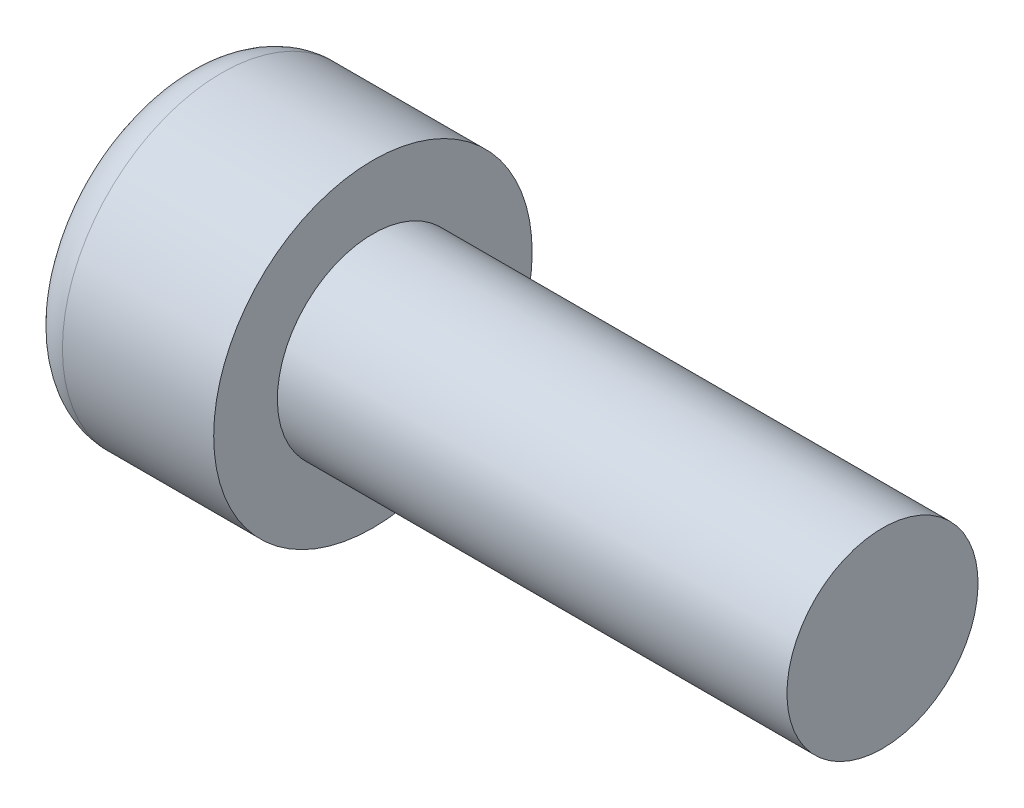
ISO-10303-21;
HEADER;
FILE_DESCRIPTION(('STEP AP214'),'2;1');
FILE_NAME('part.step','',(''),(''),'','','');
FILE_SCHEMA(('AUTOMOTIVE_DESIGN { 1 0 10303 214 1 1 1 1 }'));
ENDSEC;
DATA;
#1=APPLICATION_CONTEXT('core data for automotive mechanical design processes');
#2=APPLICATION_PROTOCOL_DEFINITION('international standard','automotive_design',2000,#1);
#3=PRODUCT_CONTEXT('',#1,'mechanical');
#4=PRODUCT('Part','Part','',(#3));
#5=PRODUCT_RELATED_PRODUCT_CATEGORY('part','',(#4));
#6=PRODUCT_DEFINITION_FORMATION('','',#4);
#7=PRODUCT_DEFINITION_CONTEXT('part definition',#1,'design');
#8=PRODUCT_DEFINITION('design','',#6,#7);
#9=PRODUCT_DEFINITION_SHAPE('','',#8);
#10=(LENGTH_UNIT() NAMED_UNIT(*) SI_UNIT(.MILLI.,.METRE.));
#11=(NAMED_UNIT(*) PLANE_ANGLE_UNIT() SI_UNIT($,.RADIAN.));
#12=(NAMED_UNIT(*) SI_UNIT($,.STERADIAN.) SOLID_ANGLE_UNIT());
#13=UNCERTAINTY_MEASURE_WITH_UNIT(LENGTH_MEASURE(1.E-05),#10,'distance_accuracy_value','');
#14=(GEOMETRIC_REPRESENTATION_CONTEXT(3) GLOBAL_UNCERTAINTY_ASSIGNED_CONTEXT((#13)) GLOBAL_UNIT_ASSIGNED_CONTEXT((#10,
#11,#12)) REPRESENTATION_CONTEXT('',''));
#15=CARTESIAN_POINT('',(0.,0.,0.));
#16=DIRECTION('',(0.,0.,1.));
#17=DIRECTION('',(1.,0.,0.));
#18=AXIS2_PLACEMENT_3D('',#15,#16,#17);
#19=CARTESIAN_POINT('',(0.,0.,0.));
#20=DIRECTION('',(1.,0.,0.));
#21=DIRECTION('',(0.,1.,0.));
#22=AXIS2_PLACEMENT_3D('',#19,#20,#21);
#23=PLANE('',#22);
#24=DIRECTION('',(0.,-0.5,-0.866025403784439));
#25=VECTOR('',#24,1.);
#26=CARTESIAN_POINT('',(0.,2.88675134594813,0.));
#27=LINE('',#26,#25);
#28=CARTESIAN_POINT('',(0.,2.88675134594813,0.));
#29=VERTEX_POINT('',#28);
#30=CARTESIAN_POINT('',(0.,1.44337567297407,-2.5));
#31=VERTEX_POINT('',#30);
#32=EDGE_CURVE('E123',#29,#31,#27,.T.);
#33=ORIENTED_EDGE('',*,*,#32,.F.);
#34=DIRECTION('',(0.,0.5,-0.866025403784439));
#35=VECTOR('',#34,1.);
#36=CARTESIAN_POINT('',(0.,1.44337567297407,2.5));
#37=LINE('',#36,#35);
#38=CARTESIAN_POINT('',(0.,1.44337567297407,2.5));
#39=VERTEX_POINT('',#38);
#40=EDGE_CURVE('E49',#39,#29,#37,.T.);
#41=ORIENTED_EDGE('',*,*,#40,.F.);
#42=DIRECTION('',(0.,1.,0.));
#43=VECTOR('',#42,1.);
#44=CARTESIAN_POINT('',(0.,-1.44337567297407,2.5));
#45=LINE('',#44,#43);
#46=CARTESIAN_POINT('',(0.,-1.44337567297407,2.5));
#47=VERTEX_POINT('',#46);
#48=EDGE_CURVE('E132',#47,#39,#45,.T.);
#49=ORIENTED_EDGE('',*,*,#48,.F.);
#50=DIRECTION('',(0.,0.5,0.866025403784439));
#51=VECTOR('',#50,1.);
#52=CARTESIAN_POINT('',(0.,-2.88675134594813,0.));
#53=LINE('',#52,#51);
#54=CARTESIAN_POINT('',(0.,-2.88675134594813,0.));
#55=VERTEX_POINT('',#54);
#56=EDGE_CURVE('E130',#55,#47,#53,.T.);
#57=ORIENTED_EDGE('',*,*,#56,.F.);
#58=DIRECTION('',(0.,-0.5,0.866025403784439));
#59=VECTOR('',#58,1.);
#60=CARTESIAN_POINT('',(0.,-1.44337567297406,-2.5));
#61=LINE('',#60,#59);
#62=CARTESIAN_POINT('',(0.,-1.44337567297406,-2.5));
#63=VERTEX_POINT('',#62);
#64=EDGE_CURVE('E97',#63,#55,#61,.T.);
#65=ORIENTED_EDGE('',*,*,#64,.F.);
#66=DIRECTION('',(0.,-1.,0.));
#67=VECTOR('',#66,1.);
#68=CARTESIAN_POINT('',(0.,1.44337567297407,-2.5));
#69=LINE('',#68,#67);
#70=EDGE_CURVE('E126',#31,#63,#69,.T.);
#71=ORIENTED_EDGE('',*,*,#70,.F.);
#72=EDGE_LOOP('',(#33,#41,#49,#57,#65,#71));
#73=FACE_BOUND('',#72,.T.);
#74=CARTESIAN_POINT('',(0.,0.,0.));
#75=DIRECTION('',(-1.,0.,0.));
#76=DIRECTION('',(0.,-1.,0.));
#77=AXIS2_PLACEMENT_3D('',#74,#75,#76);
#78=CIRCLE('',#77,3.75);
#79=CARTESIAN_POINT('',(0.,-3.75,0.));
#80=VERTEX_POINT('',#79);
#81=EDGE_CURVE('E11',#80,#80,#78,.T.);
#82=ORIENTED_EDGE('',*,*,#81,.T.);
#83=EDGE_LOOP('',(#82));
#84=FACE_BOUND('',#83,.T.);
#85=ADVANCED_FACE('F35',(#73,#84),#23,.F.);
#86=CARTESIAN_POINT('',(1.25,0.,0.));
#87=DIRECTION('',(-1.,0.,0.));
#88=DIRECTION('',(0.,-1.,0.));
#89=AXIS2_PLACEMENT_3D('',#86,#87,#88);
#90=TOROIDAL_SURFACE('',#89,3.75,1.25);
#91=ORIENTED_EDGE('',*,*,#81,.F.);
#92=EDGE_LOOP('',(#91));
#93=FACE_BOUND('',#92,.T.);
#94=CARTESIAN_POINT('',(1.25,0.,0.));
#95=DIRECTION('',(-1.,0.,0.));
#96=DIRECTION('',(0.,-1.,0.));
#97=AXIS2_PLACEMENT_3D('',#94,#95,#96);
#98=CIRCLE('',#97,5.);
#99=CARTESIAN_POINT('',(1.25,-5.,0.));
#100=VERTEX_POINT('',#99);
#101=EDGE_CURVE('E42',#100,#100,#98,.T.);
#102=ORIENTED_EDGE('',*,*,#101,.T.);
#103=EDGE_LOOP('',(#102));
#104=FACE_BOUND('',#103,.T.);
#105=ADVANCED_FACE('F152',(#93,#104),#90,.T.);
#106=CARTESIAN_POINT('',(0.,0.,0.));
#107=DIRECTION('',(-1.,0.,0.));
#108=DIRECTION('',(0.,-1.,0.));
#109=AXIS2_PLACEMENT_3D('',#106,#107,#108);
#110=CYLINDRICAL_SURFACE('',#109,5.);
#111=ORIENTED_EDGE('',*,*,#101,.F.);
#112=EDGE_LOOP('',(#111));
#113=FACE_BOUND('',#112,.T.);
#114=CARTESIAN_POINT('',(6.,0.,0.));
#115=DIRECTION('',(-1.,0.,0.));
#116=DIRECTION('',(0.,-1.,0.));
#117=AXIS2_PLACEMENT_3D('',#114,#115,#116);
#118=CIRCLE('',#117,5.);
#119=CARTESIAN_POINT('',(6.,-5.,0.));
#120=VERTEX_POINT('',#119);
#121=EDGE_CURVE('E147',#120,#120,#118,.T.);
#122=ORIENTED_EDGE('',*,*,#121,.T.);
#123=EDGE_LOOP('',(#122));
#124=FACE_BOUND('',#123,.T.);
#125=ADVANCED_FACE('F154',(#113,#124),#110,.T.);
#126=CARTESIAN_POINT('',(6.,5.,0.));
#127=DIRECTION('',(-1.,0.,0.));
#128=DIRECTION('',(0.,-1.,0.));
#129=AXIS2_PLACEMENT_3D('',#126,#127,#128);
#130=PLANE('',#129);
#131=ORIENTED_EDGE('',*,*,#121,.F.);
#132=EDGE_LOOP('',(#131));
#133=FACE_BOUND('',#132,.T.);
#134=CARTESIAN_POINT('',(6.,0.,0.));
#135=DIRECTION('',(-1.,0.,0.));
#136=DIRECTION('',(0.,-1.,0.));
#137=AXIS2_PLACEMENT_3D('',#134,#135,#136);
#138=CIRCLE('',#137,2.99999999999999);
#139=CARTESIAN_POINT('',(6.,-2.99999999999999,0.));
#140=VERTEX_POINT('',#139);
#141=EDGE_CURVE('E144',#140,#140,#138,.T.);
#142=ORIENTED_EDGE('',*,*,#141,.T.);
#143=EDGE_LOOP('',(#142));
#144=FACE_BOUND('',#143,.T.);
#145=ADVANCED_FACE('F157',(#133,#144),#130,.F.);
#146=CARTESIAN_POINT('',(0.,0.,0.));
#147=DIRECTION('',(-1.,0.,0.));
#148=DIRECTION('',(0.,-1.,0.));
#149=AXIS2_PLACEMENT_3D('',#146,#147,#148);
#150=CYLINDRICAL_SURFACE('',#149,2.99999999999999);
#151=ORIENTED_EDGE('',*,*,#141,.F.);
#152=EDGE_LOOP('',(#151));
#153=FACE_BOUND('',#152,.T.);
#154=CARTESIAN_POINT('',(22.,0.,0.));
#155=DIRECTION('',(-1.,0.,0.));
#156=DIRECTION('',(0.,-1.,0.));
#157=AXIS2_PLACEMENT_3D('',#154,#155,#156);
#158=CIRCLE('',#157,3.);
#159=CARTESIAN_POINT('',(22.,-2.99999999999999,0.));
#160=VERTEX_POINT('',#159);
#161=EDGE_CURVE('E136',#160,#160,#158,.T.);
#162=ORIENTED_EDGE('',*,*,#161,.T.);
#163=EDGE_LOOP('',(#162));
#164=FACE_BOUND('',#163,.T.);
#165=ADVANCED_FACE('F163',(#153,#164),#150,.T.);
#166=CARTESIAN_POINT('',(22.,3.,0.));
#167=DIRECTION('',(-1.,0.,0.));
#168=DIRECTION('',(0.,-1.,0.));
#169=AXIS2_PLACEMENT_3D('',#166,#167,#168);
#170=PLANE('',#169);
#171=ORIENTED_EDGE('',*,*,#161,.F.);
#172=EDGE_LOOP('',(#171));
#173=FACE_BOUND('',#172,.T.);
#174=ADVANCED_FACE('F169',(#173),#170,.F.);
#175=CARTESIAN_POINT('',(3.5,1.44337567297406,2.5));
#176=DIRECTION('',(0.,0.866025403784439,0.5));
#177=DIRECTION('',(0.,-0.5,0.866025403784439));
#178=AXIS2_PLACEMENT_3D('',#175,#176,#177);
#179=PLANE('',#178);
#180=ORIENTED_EDGE('',*,*,#40,.T.);
#181=DIRECTION('',(-1.,0.,0.));
#182=VECTOR('',#181,1.);
#183=CARTESIAN_POINT('',(3.5,2.88675134594813,0.));
#184=LINE('',#183,#182);
#185=CARTESIAN_POINT('',(3.5,2.88675134594813,0.));
#186=VERTEX_POINT('',#185);
#187=EDGE_CURVE('E79',#186,#29,#184,.T.);
#188=ORIENTED_EDGE('',*,*,#187,.F.);
#189=DIRECTION('',(0.,0.5,-0.866025403784439));
#190=VECTOR('',#189,1.);
#191=CARTESIAN_POINT('',(3.5,1.44337567297406,2.5));
#192=LINE('',#191,#190);
#193=CARTESIAN_POINT('',(3.5,1.44337567297406,2.5));
#194=VERTEX_POINT('',#193);
#195=EDGE_CURVE('E134',#194,#186,#192,.T.);
#196=ORIENTED_EDGE('',*,*,#195,.F.);
#197=DIRECTION('',(-1.,0.,0.));
#198=VECTOR('',#197,1.);
#199=CARTESIAN_POINT('',(3.5,1.44337567297406,2.5));
#200=LINE('',#199,#198);
#201=EDGE_CURVE('E57',#194,#39,#200,.T.);
#202=ORIENTED_EDGE('',*,*,#201,.T.);
#203=EDGE_LOOP('',(#180,#188,#196,#202));
#204=FACE_BOUND('',#203,.T.);
#205=ADVANCED_FACE('F174',(#204),#179,.F.);
#206=CARTESIAN_POINT('',(3.5,-1.44337567297407,2.5));
#207=DIRECTION('',(0.,0.,1.));
#208=DIRECTION('',(1.,0.,0.));
#209=AXIS2_PLACEMENT_3D('',#206,#207,#208);
#210=PLANE('',#209);
#211=ORIENTED_EDGE('',*,*,#48,.T.);
#212=ORIENTED_EDGE('',*,*,#201,.F.);
#213=DIRECTION('',(0.,1.,0.));
#214=VECTOR('',#213,1.);
#215=CARTESIAN_POINT('',(3.5,-1.44337567297407,2.5));
#216=LINE('',#215,#214);
#217=CARTESIAN_POINT('',(3.5,-1.44337567297407,2.5));
#218=VERTEX_POINT('',#217);
#219=EDGE_CURVE('E109',#218,#194,#216,.T.);
#220=ORIENTED_EDGE('',*,*,#219,.F.);
#221=DIRECTION('',(-1.,0.,0.));
#222=VECTOR('',#221,1.);
#223=CARTESIAN_POINT('',(3.5,-1.44337567297407,2.5));
#224=LINE('',#223,#222);
#225=EDGE_CURVE('E101',#218,#47,#224,.T.);
#226=ORIENTED_EDGE('',*,*,#225,.T.);
#227=EDGE_LOOP('',(#211,#212,#220,#226));
#228=FACE_BOUND('',#227,.T.);
#229=ADVANCED_FACE('F179',(#228),#210,.F.);
#230=CARTESIAN_POINT('',(3.5,-2.88675134594813,0.));
#231=DIRECTION('',(0.,-0.866025403784439,0.5));
#232=DIRECTION('',(0.,-0.5,-0.866025403784439));
#233=AXIS2_PLACEMENT_3D('',#230,#231,#232);
#234=PLANE('',#233);
#235=ORIENTED_EDGE('',*,*,#56,.T.);
#236=ORIENTED_EDGE('',*,*,#225,.F.);
#237=DIRECTION('',(0.,0.5,0.866025403784439));
#238=VECTOR('',#237,1.);
#239=CARTESIAN_POINT('',(3.5,-2.88675134594813,0.));
#240=LINE('',#239,#238);
#241=CARTESIAN_POINT('',(3.5,-2.88675134594813,0.));
#242=VERTEX_POINT('',#241);
#243=EDGE_CURVE('E105',#242,#218,#240,.T.);
#244=ORIENTED_EDGE('',*,*,#243,.F.);
#245=DIRECTION('',(-1.,0.,0.));
#246=VECTOR('',#245,1.);
#247=CARTESIAN_POINT('',(3.5,-2.88675134594813,0.));
#248=LINE('',#247,#246);
#249=EDGE_CURVE('E90',#242,#55,#248,.T.);
#250=ORIENTED_EDGE('',*,*,#249,.T.);
#251=EDGE_LOOP('',(#235,#236,#244,#250));
#252=FACE_BOUND('',#251,.T.);
#253=ADVANCED_FACE('F106',(#252),#234,.F.);
#254=CARTESIAN_POINT('',(3.5,-1.44337567297406,-2.5));
#255=DIRECTION('',(0.,-0.866025403784439,-0.5));
#256=DIRECTION('',(0.,0.5,-0.866025403784439));
#257=AXIS2_PLACEMENT_3D('',#254,#255,#256);
#258=PLANE('',#257);
#259=ORIENTED_EDGE('',*,*,#64,.T.);
#260=ORIENTED_EDGE('',*,*,#249,.F.);
#261=DIRECTION('',(0.,-0.5,0.866025403784439));
#262=VECTOR('',#261,1.);
#263=CARTESIAN_POINT('',(3.5,-1.44337567297406,-2.5));
#264=LINE('',#263,#262);
#265=CARTESIAN_POINT('',(3.5,-1.44337567297406,-2.5));
#266=VERTEX_POINT('',#265);
#267=EDGE_CURVE('E94',#266,#242,#264,.T.);
#268=ORIENTED_EDGE('',*,*,#267,.F.);
#269=DIRECTION('',(-1.,0.,0.));
#270=VECTOR('',#269,1.);
#271=CARTESIAN_POINT('',(3.5,-1.44337567297406,-2.5));
#272=LINE('',#271,#270);
#273=EDGE_CURVE('E102',#266,#63,#272,.T.);
#274=ORIENTED_EDGE('',*,*,#273,.T.);
#275=EDGE_LOOP('',(#259,#260,#268,#274));
#276=FACE_BOUND('',#275,.T.);
#277=ADVANCED_FACE('F92',(#276),#258,.F.);
#278=CARTESIAN_POINT('',(3.5,1.44337567297406,-2.5));
#279=DIRECTION('',(0.,0.,-1.));
#280=DIRECTION('',(-1.,0.,0.));
#281=AXIS2_PLACEMENT_3D('',#278,#279,#280);
#282=PLANE('',#281);
#283=ORIENTED_EDGE('',*,*,#70,.T.);
#284=ORIENTED_EDGE('',*,*,#273,.F.);
#285=DIRECTION('',(0.,-1.,0.));
#286=VECTOR('',#285,1.);
#287=CARTESIAN_POINT('',(3.5,1.44337567297406,-2.5));
#288=LINE('',#287,#286);
#289=CARTESIAN_POINT('',(3.5,1.44337567297406,-2.5));
#290=VERTEX_POINT('',#289);
#291=EDGE_CURVE('E115',#290,#266,#288,.T.);
#292=ORIENTED_EDGE('',*,*,#291,.F.);
#293=DIRECTION('',(-1.,0.,0.));
#294=VECTOR('',#293,1.);
#295=CARTESIAN_POINT('',(3.5,1.44337567297406,-2.5));
#296=LINE('',#295,#294);
#297=EDGE_CURVE('E139',#290,#31,#296,.T.);
#298=ORIENTED_EDGE('',*,*,#297,.T.);
#299=EDGE_LOOP('',(#283,#284,#292,#298));
#300=FACE_BOUND('',#299,.T.);
#301=ADVANCED_FACE('F205',(#300),#282,.F.);
#302=CARTESIAN_POINT('',(3.5,2.88675134594813,0.));
#303=DIRECTION('',(0.,0.866025403784439,-0.5));
#304=DIRECTION('',(0.,0.5,0.866025403784439));
#305=AXIS2_PLACEMENT_3D('',#302,#303,#304);
#306=PLANE('',#305);
#307=ORIENTED_EDGE('',*,*,#32,.T.);
#308=ORIENTED_EDGE('',*,*,#297,.F.);
#309=DIRECTION('',(0.,-0.5,-0.866025403784439));
#310=VECTOR('',#309,1.);
#311=CARTESIAN_POINT('',(3.5,2.88675134594813,0.));
#312=LINE('',#311,#310);
#313=EDGE_CURVE('E117',#186,#290,#312,.T.);
#314=ORIENTED_EDGE('',*,*,#313,.F.);
#315=ORIENTED_EDGE('',*,*,#187,.T.);
#316=EDGE_LOOP('',(#307,#308,#314,#315));
#317=FACE_BOUND('',#316,.T.);
#318=ADVANCED_FACE('F193',(#317),#306,.F.);
#319=CARTESIAN_POINT('',(3.5,0.,0.));
#320=DIRECTION('',(-1.,0.,0.));
#321=DIRECTION('',(0.,-1.,0.));
#322=AXIS2_PLACEMENT_3D('',#319,#320,#321);
#323=PLANE('',#322);
#324=ORIENTED_EDGE('',*,*,#195,.T.);
#325=ORIENTED_EDGE('',*,*,#313,.T.);
#326=ORIENTED_EDGE('',*,*,#291,.T.);
#327=ORIENTED_EDGE('',*,*,#267,.T.);
#328=ORIENTED_EDGE('',*,*,#243,.T.);
#329=ORIENTED_EDGE('',*,*,#219,.T.);
#330=EDGE_LOOP('',(#324,#325,#326,#327,#328,#329));
#331=FACE_BOUND('',#330,.T.);
#332=ADVANCED_FACE('F112',(#331),#323,.T.);
#333=CLOSED_SHELL('',(#85,#105,#125,#145,#165,#174,#205,#229,#253,#277,#301,#318,#332));
#334=MANIFOLD_SOLID_BREP('B2',#333);
#335=ADVANCED_BREP_SHAPE_REPRESENTATION('',(#18,#334),#14);
#336=SHAPE_DEFINITION_REPRESENTATION(#9,#335);
ENDSEC;
END-ISO-10303-21;
